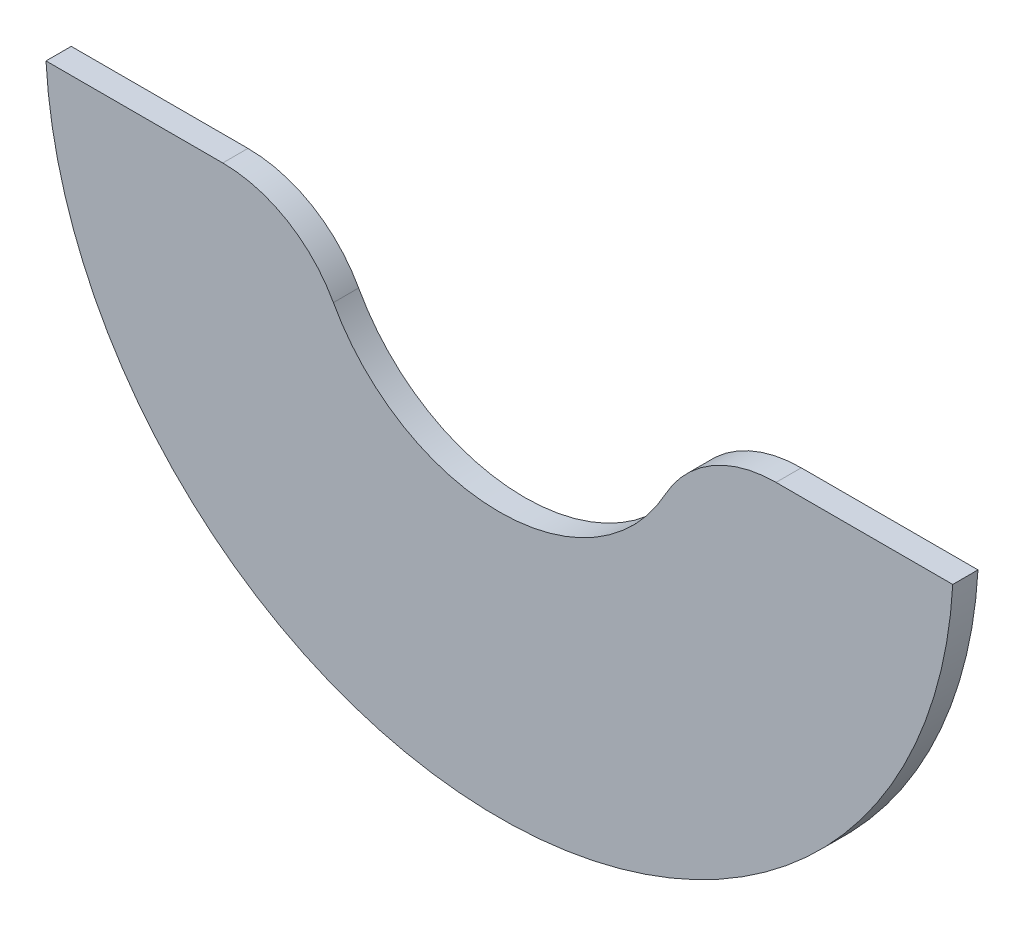
ISO-10303-21;
HEADER;
FILE_DESCRIPTION(('STEP AP214'),'2;1');
FILE_NAME('part.step','',(''),(''),'','','');
FILE_SCHEMA(('AUTOMOTIVE_DESIGN { 1 0 10303 214 1 1 1 1 }'));
ENDSEC;
DATA;
#1=APPLICATION_CONTEXT('core data for automotive mechanical design processes');
#2=APPLICATION_PROTOCOL_DEFINITION('international standard','automotive_design',2000,#1);
#3=PRODUCT_CONTEXT('',#1,'mechanical');
#4=PRODUCT('Part','Part','',(#3));
#5=PRODUCT_RELATED_PRODUCT_CATEGORY('part','',(#4));
#6=PRODUCT_DEFINITION_FORMATION('','',#4);
#7=PRODUCT_DEFINITION_CONTEXT('part definition',#1,'design');
#8=PRODUCT_DEFINITION('design','',#6,#7);
#9=PRODUCT_DEFINITION_SHAPE('','',#8);
#10=(LENGTH_UNIT() NAMED_UNIT(*) SI_UNIT(.MILLI.,.METRE.));
#11=(NAMED_UNIT(*) PLANE_ANGLE_UNIT() SI_UNIT($,.RADIAN.));
#12=(NAMED_UNIT(*) SI_UNIT($,.STERADIAN.) SOLID_ANGLE_UNIT());
#13=UNCERTAINTY_MEASURE_WITH_UNIT(LENGTH_MEASURE(1.E-05),#10,'distance_accuracy_value','');
#14=(GEOMETRIC_REPRESENTATION_CONTEXT(3) GLOBAL_UNCERTAINTY_ASSIGNED_CONTEXT((#13)) GLOBAL_UNIT_ASSIGNED_CONTEXT((#10,
#11,#12)) REPRESENTATION_CONTEXT('',''));
#15=CARTESIAN_POINT('',(0.,0.,0.));
#16=DIRECTION('',(0.,0.,1.));
#17=DIRECTION('',(1.,0.,0.));
#18=AXIS2_PLACEMENT_3D('',#15,#16,#17);
#19=CARTESIAN_POINT('',(-17.9722007556114,-1.,1.));
#20=DIRECTION('',(0.,-1.,0.));
#21=DIRECTION('',(0.,0.,-1.));
#22=AXIS2_PLACEMENT_3D('',#19,#20,#21);
#23=PLANE('',#22);
#24=DIRECTION('',(-1.,0.,0.));
#25=VECTOR('',#24,1.);
#26=CARTESIAN_POINT('',(-17.9722007556114,-1.,0.));
#27=LINE('',#26,#25);
#28=CARTESIAN_POINT('',(17.9722007556114,-1.,0.));
#29=VERTEX_POINT('',#28);
#30=CARTESIAN_POINT('',(10.9658560997307,-1.,0.));
#31=VERTEX_POINT('',#30);
#32=EDGE_CURVE('E107',#29,#31,#27,.T.);
#33=ORIENTED_EDGE('',*,*,#32,.T.);
#34=DIRECTION('',(0.,0.,1.));
#35=VECTOR('',#34,1.);
#36=CARTESIAN_POINT('',(10.9658560997307,-1.,1.));
#37=LINE('',#36,#35);
#38=CARTESIAN_POINT('',(10.9658560997307,-1.,1.));
#39=VERTEX_POINT('',#38);
#40=EDGE_CURVE('E95',#31,#39,#37,.T.);
#41=ORIENTED_EDGE('',*,*,#40,.T.);
#42=DIRECTION('',(-1.,0.,0.));
#43=VECTOR('',#42,1.);
#44=CARTESIAN_POINT('',(-17.9722007556114,-1.,1.));
#45=LINE('',#44,#43);
#46=CARTESIAN_POINT('',(17.9722007556114,-1.,1.));
#47=VERTEX_POINT('',#46);
#48=EDGE_CURVE('E88',#47,#39,#45,.T.);
#49=ORIENTED_EDGE('',*,*,#48,.F.);
#50=DIRECTION('',(0.,0.,-1.));
#51=VECTOR('',#50,1.);
#52=CARTESIAN_POINT('',(17.9722007556114,-1.,1.));
#53=LINE('',#52,#51);
#54=EDGE_CURVE('E92',#47,#29,#53,.T.);
#55=ORIENTED_EDGE('',*,*,#54,.T.);
#56=EDGE_LOOP('',(#33,#41,#49,#55));
#57=FACE_BOUND('',#56,.T.);
#58=ADVANCED_FACE('F32',(#57),#23,.F.);
#59=CARTESIAN_POINT('',(0.,0.,1.));
#60=DIRECTION('',(0.,0.,-1.));
#61=DIRECTION('',(-1.,0.,0.));
#62=AXIS2_PLACEMENT_3D('',#59,#60,#61);
#63=CYLINDRICAL_SURFACE('',#62,18.);
#64=CARTESIAN_POINT('',(0.,0.,0.));
#65=DIRECTION('',(0.,0.,1.));
#66=DIRECTION('',(1.,0.,0.));
#67=AXIS2_PLACEMENT_3D('',#64,#65,#66);
#68=CIRCLE('',#67,18.);
#69=CARTESIAN_POINT('',(-17.9722007556114,-1.,0.));
#70=VERTEX_POINT('',#69);
#71=EDGE_CURVE('E111',#70,#29,#68,.T.);
#72=ORIENTED_EDGE('',*,*,#71,.T.);
#73=ORIENTED_EDGE('',*,*,#54,.F.);
#74=CARTESIAN_POINT('',(0.,0.,1.));
#75=DIRECTION('',(0.,0.,1.));
#76=DIRECTION('',(1.,0.,0.));
#77=AXIS2_PLACEMENT_3D('',#74,#75,#76);
#78=CIRCLE('',#77,18.);
#79=CARTESIAN_POINT('',(-17.9722007556114,-1.,1.));
#80=VERTEX_POINT('',#79);
#81=EDGE_CURVE('E101',#80,#47,#78,.T.);
#82=ORIENTED_EDGE('',*,*,#81,.F.);
#83=DIRECTION('',(0.,0.,-1.));
#84=VECTOR('',#83,1.);
#85=CARTESIAN_POINT('',(-17.9722007556114,-1.,1.));
#86=LINE('',#85,#84);
#87=EDGE_CURVE('E97',#80,#70,#86,.T.);
#88=ORIENTED_EDGE('',*,*,#87,.T.);
#89=EDGE_LOOP('',(#72,#73,#82,#88));
#90=FACE_BOUND('',#89,.T.);
#91=ADVANCED_FACE('F109',(#90),#63,.T.);
#92=CARTESIAN_POINT('',(-10.9658560997307,-1.,1.));
#93=VERTEX_POINT('',#92);
#94=EDGE_CURVE('E98',#93,#80,#45,.T.);
#95=ORIENTED_EDGE('',*,*,#94,.F.);
#96=DIRECTION('',(0.,0.,1.));
#97=VECTOR('',#96,1.);
#98=CARTESIAN_POINT('',(-10.9658560997307,-1.,1.));
#99=LINE('',#98,#97);
#100=CARTESIAN_POINT('',(-10.9658560997307,-1.,0.));
#101=VERTEX_POINT('',#100);
#102=EDGE_CURVE('E11',#93,#101,#99,.F.);
#103=ORIENTED_EDGE('',*,*,#102,.T.);
#104=EDGE_CURVE('E129',#101,#70,#27,.T.);
#105=ORIENTED_EDGE('',*,*,#104,.T.);
#106=ORIENTED_EDGE('',*,*,#87,.F.);
#107=EDGE_LOOP('',(#95,#103,#105,#106));
#108=FACE_BOUND('',#107,.T.);
#109=ADVANCED_FACE('F140',(#108),#23,.F.);
#110=CARTESIAN_POINT('',(0.,0.,1.));
#111=DIRECTION('',(0.,0.,1.));
#112=DIRECTION('',(1.,0.,0.));
#113=AXIS2_PLACEMENT_3D('',#110,#111,#112);
#114=PLANE('',#113);
#115=ORIENTED_EDGE('',*,*,#48,.T.);
#116=CARTESIAN_POINT('',(10.9658560997307,-6.,1.));
#117=DIRECTION('',(0.,0.,1.));
#118=DIRECTION('',(1.,0.,0.));
#119=AXIS2_PLACEMENT_3D('',#116,#117,#118);
#120=CIRCLE('',#119,5.);
#121=CARTESIAN_POINT('',(6.57951365983839,-3.6,1.));
#122=VERTEX_POINT('',#121);
#123=EDGE_CURVE('E119',#39,#122,#120,.T.);
#124=ORIENTED_EDGE('',*,*,#123,.T.);
#125=CARTESIAN_POINT('',(0.,0.,1.));
#126=DIRECTION('',(0.,0.,1.));
#127=DIRECTION('',(1.,0.,0.));
#128=AXIS2_PLACEMENT_3D('',#125,#126,#127);
#129=CIRCLE('',#128,7.5);
#130=CARTESIAN_POINT('',(-6.57951365983839,-3.6,1.));
#131=VERTEX_POINT('',#130);
#132=EDGE_CURVE('E132',#131,#122,#129,.T.);
#133=ORIENTED_EDGE('',*,*,#132,.F.);
#134=CARTESIAN_POINT('',(-10.9658560997307,-6.,1.));
#135=DIRECTION('',(0.,0.,1.));
#136=DIRECTION('',(1.,0.,0.));
#137=AXIS2_PLACEMENT_3D('',#134,#135,#136);
#138=CIRCLE('',#137,5.);
#139=EDGE_CURVE('E113',#131,#93,#138,.T.);
#140=ORIENTED_EDGE('',*,*,#139,.T.);
#141=ORIENTED_EDGE('',*,*,#94,.T.);
#142=ORIENTED_EDGE('',*,*,#81,.T.);
#143=EDGE_LOOP('',(#115,#124,#133,#140,#141,#142));
#144=FACE_BOUND('',#143,.T.);
#145=ADVANCED_FACE('F102',(#144),#114,.T.);
#146=CARTESIAN_POINT('',(0.,0.,0.));
#147=DIRECTION('',(0.,0.,1.));
#148=DIRECTION('',(1.,0.,0.));
#149=AXIS2_PLACEMENT_3D('',#146,#147,#148);
#150=PLANE('',#149);
#151=CARTESIAN_POINT('',(0.,0.,0.));
#152=DIRECTION('',(0.,0.,1.));
#153=DIRECTION('',(1.,0.,0.));
#154=AXIS2_PLACEMENT_3D('',#151,#152,#153);
#155=CIRCLE('',#154,7.5);
#156=CARTESIAN_POINT('',(-6.57951365983839,-3.6,0.));
#157=VERTEX_POINT('',#156);
#158=CARTESIAN_POINT('',(6.57951365983839,-3.6,0.));
#159=VERTEX_POINT('',#158);
#160=EDGE_CURVE('E127',#157,#159,#155,.T.);
#161=ORIENTED_EDGE('',*,*,#160,.T.);
#162=CARTESIAN_POINT('',(10.9658560997307,-6.,0.));
#163=DIRECTION('',(0.,0.,1.));
#164=DIRECTION('',(1.,0.,0.));
#165=AXIS2_PLACEMENT_3D('',#162,#163,#164);
#166=CIRCLE('',#165,5.);
#167=EDGE_CURVE('E40',#159,#31,#166,.F.);
#168=ORIENTED_EDGE('',*,*,#167,.T.);
#169=ORIENTED_EDGE('',*,*,#32,.F.);
#170=ORIENTED_EDGE('',*,*,#71,.F.);
#171=ORIENTED_EDGE('',*,*,#104,.F.);
#172=CARTESIAN_POINT('',(-10.9658560997307,-6.,0.));
#173=DIRECTION('',(0.,0.,1.));
#174=DIRECTION('',(1.,0.,0.));
#175=AXIS2_PLACEMENT_3D('',#172,#173,#174);
#176=CIRCLE('',#175,5.);
#177=EDGE_CURVE('E47',#101,#157,#176,.F.);
#178=ORIENTED_EDGE('',*,*,#177,.T.);
#179=EDGE_LOOP('',(#161,#168,#169,#170,#171,#178));
#180=FACE_BOUND('',#179,.T.);
#181=ADVANCED_FACE('F126',(#180),#150,.F.);
#182=CARTESIAN_POINT('',(0.,0.,0.));
#183=DIRECTION('',(0.,0.,1.));
#184=DIRECTION('',(1.,0.,0.));
#185=AXIS2_PLACEMENT_3D('',#182,#183,#184);
#186=CYLINDRICAL_SURFACE('',#185,7.5);
#187=ORIENTED_EDGE('',*,*,#132,.T.);
#188=DIRECTION('',(0.,0.,1.));
#189=VECTOR('',#188,1.);
#190=CARTESIAN_POINT('',(6.57951365983839,-3.6,0.));
#191=LINE('',#190,#189);
#192=EDGE_CURVE('E54',#122,#159,#191,.F.);
#193=ORIENTED_EDGE('',*,*,#192,.T.);
#194=ORIENTED_EDGE('',*,*,#160,.F.);
#195=DIRECTION('',(0.,0.,1.));
#196=VECTOR('',#195,1.);
#197=CARTESIAN_POINT('',(-6.57951365983839,-3.6,0.));
#198=LINE('',#197,#196);
#199=EDGE_CURVE('E121',#157,#131,#198,.T.);
#200=ORIENTED_EDGE('',*,*,#199,.T.);
#201=EDGE_LOOP('',(#187,#193,#194,#200));
#202=FACE_BOUND('',#201,.T.);
#203=ADVANCED_FACE('F134',(#202),#186,.F.);
#204=CARTESIAN_POINT('',(10.9658560997307,-6.,0.));
#205=DIRECTION('',(0.,0.,1.));
#206=DIRECTION('',(1.,0.,0.));
#207=AXIS2_PLACEMENT_3D('',#204,#205,#206);
#208=CYLINDRICAL_SURFACE('',#207,5.);
#209=ORIENTED_EDGE('',*,*,#167,.F.);
#210=ORIENTED_EDGE('',*,*,#192,.F.);
#211=ORIENTED_EDGE('',*,*,#123,.F.);
#212=ORIENTED_EDGE('',*,*,#40,.F.);
#213=EDGE_LOOP('',(#209,#210,#211,#212));
#214=FACE_BOUND('',#213,.T.);
#215=ADVANCED_FACE('F130',(#214),#208,.T.);
#216=CARTESIAN_POINT('',(-10.9658560997307,-6.,0.));
#217=DIRECTION('',(0.,0.,1.));
#218=DIRECTION('',(1.,0.,0.));
#219=AXIS2_PLACEMENT_3D('',#216,#217,#218);
#220=CYLINDRICAL_SURFACE('',#219,5.);
#221=ORIENTED_EDGE('',*,*,#139,.F.);
#222=ORIENTED_EDGE('',*,*,#199,.F.);
#223=ORIENTED_EDGE('',*,*,#177,.F.);
#224=ORIENTED_EDGE('',*,*,#102,.F.);
#225=EDGE_LOOP('',(#221,#222,#223,#224));
#226=FACE_BOUND('',#225,.T.);
#227=ADVANCED_FACE('F34',(#226),#220,.T.);
#228=CLOSED_SHELL('',(#58,#91,#109,#145,#181,#203,#215,#227));
#229=MANIFOLD_SOLID_BREP('B2',#228);
#230=ADVANCED_BREP_SHAPE_REPRESENTATION('',(#18,#229),#14);
#231=SHAPE_DEFINITION_REPRESENTATION(#9,#230);
ENDSEC;
END-ISO-10303-21;
